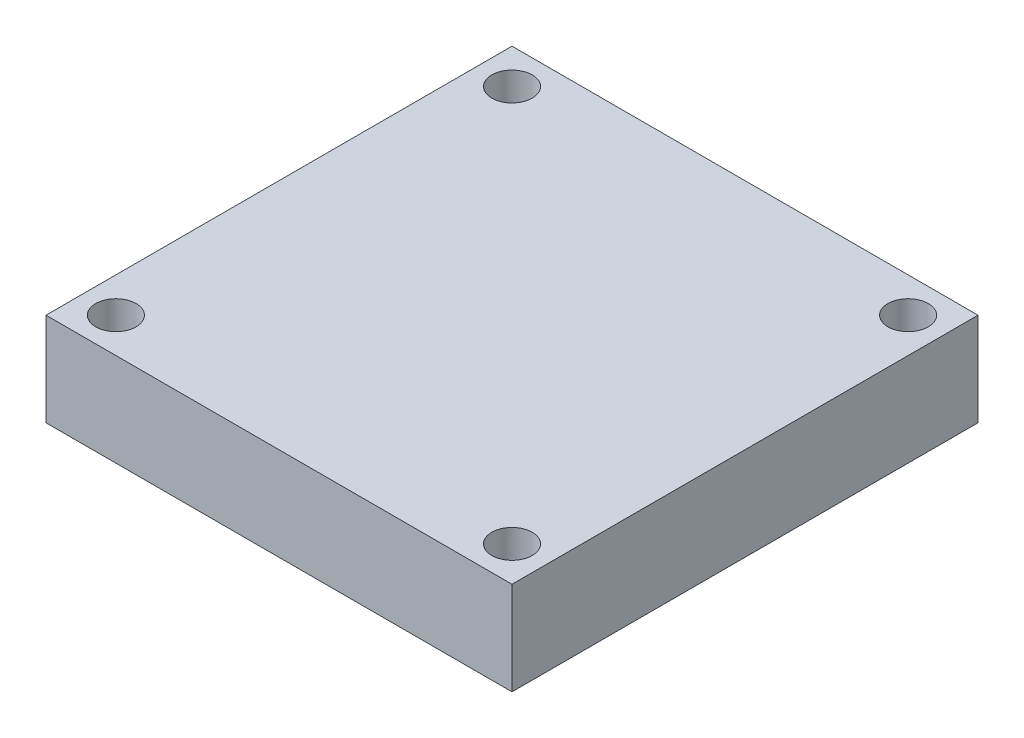
ISO-10303-21;
HEADER;
FILE_DESCRIPTION(('STEP AP214'),'2;1');
FILE_NAME('part.step','',(''),(''),'','','');
FILE_SCHEMA(('AUTOMOTIVE_DESIGN { 1 0 10303 214 1 1 1 1 }'));
ENDSEC;
DATA;
#1=APPLICATION_CONTEXT('core data for automotive mechanical design processes');
#2=APPLICATION_PROTOCOL_DEFINITION('international standard','automotive_design',2000,#1);
#3=PRODUCT_CONTEXT('',#1,'mechanical');
#4=PRODUCT('Part','Part','',(#3));
#5=PRODUCT_RELATED_PRODUCT_CATEGORY('part','',(#4));
#6=PRODUCT_DEFINITION_FORMATION('','',#4);
#7=PRODUCT_DEFINITION_CONTEXT('part definition',#1,'design');
#8=PRODUCT_DEFINITION('design','',#6,#7);
#9=PRODUCT_DEFINITION_SHAPE('','',#8);
#10=(LENGTH_UNIT() NAMED_UNIT(*) SI_UNIT(.MILLI.,.METRE.));
#11=(NAMED_UNIT(*) PLANE_ANGLE_UNIT() SI_UNIT($,.RADIAN.));
#12=(NAMED_UNIT(*) SI_UNIT($,.STERADIAN.) SOLID_ANGLE_UNIT());
#13=UNCERTAINTY_MEASURE_WITH_UNIT(LENGTH_MEASURE(1.E-05),#10,'distance_accuracy_value','');
#14=(GEOMETRIC_REPRESENTATION_CONTEXT(3) GLOBAL_UNCERTAINTY_ASSIGNED_CONTEXT((#13)) GLOBAL_UNIT_ASSIGNED_CONTEXT((#10,
#11,#12)) REPRESENTATION_CONTEXT('',''));
#15=CARTESIAN_POINT('',(0.,0.,0.));
#16=DIRECTION('',(0.,0.,1.));
#17=DIRECTION('',(1.,0.,0.));
#18=AXIS2_PLACEMENT_3D('',#15,#16,#17);
#19=CARTESIAN_POINT('',(0.,6.,0.));
#20=DIRECTION('',(0.,1.,0.));
#21=DIRECTION('',(0.,0.,1.));
#22=AXIS2_PLACEMENT_3D('',#19,#20,#21);
#23=PLANE('',#22);
#24=CARTESIAN_POINT('',(12.75,6.,12.75));
#25=DIRECTION('',(0.,1.,0.));
#26=DIRECTION('',(0.,0.,1.));
#27=AXIS2_PLACEMENT_3D('',#24,#25,#26);
#28=CIRCLE('',#27,1.3);
#29=CARTESIAN_POINT('',(12.75,6.,14.05));
#30=VERTEX_POINT('',#29);
#31=EDGE_CURVE('E130',#30,#30,#28,.T.);
#32=ORIENTED_EDGE('',*,*,#31,.F.);
#33=EDGE_LOOP('',(#32));
#34=FACE_BOUND('',#33,.T.);
#35=CARTESIAN_POINT('',(-12.75,6.,-12.75));
#36=DIRECTION('',(0.,1.,0.));
#37=DIRECTION('',(0.,0.,1.));
#38=AXIS2_PLACEMENT_3D('',#35,#36,#37);
#39=CIRCLE('',#38,1.3);
#40=CARTESIAN_POINT('',(-12.75,6.,-11.45));
#41=VERTEX_POINT('',#40);
#42=EDGE_CURVE('E106',#41,#41,#39,.T.);
#43=ORIENTED_EDGE('',*,*,#42,.F.);
#44=EDGE_LOOP('',(#43));
#45=FACE_BOUND('',#44,.T.);
#46=DIRECTION('',(0.,0.,1.));
#47=VECTOR('',#46,1.);
#48=CARTESIAN_POINT('',(-15.,6.,15.));
#49=LINE('',#48,#47);
#50=CARTESIAN_POINT('',(-15.,6.,-15.));
#51=VERTEX_POINT('',#50);
#52=CARTESIAN_POINT('',(-15.,6.,15.));
#53=VERTEX_POINT('',#52);
#54=EDGE_CURVE('E91',#51,#53,#49,.T.);
#55=ORIENTED_EDGE('',*,*,#54,.T.);
#56=DIRECTION('',(1.,0.,0.));
#57=VECTOR('',#56,1.);
#58=CARTESIAN_POINT('',(15.,6.,15.));
#59=LINE('',#58,#57);
#60=CARTESIAN_POINT('',(15.,6.,15.));
#61=VERTEX_POINT('',#60);
#62=EDGE_CURVE('E86',#53,#61,#59,.T.);
#63=ORIENTED_EDGE('',*,*,#62,.T.);
#64=DIRECTION('',(0.,0.,-1.));
#65=VECTOR('',#64,1.);
#66=CARTESIAN_POINT('',(15.,6.,15.));
#67=LINE('',#66,#65);
#68=CARTESIAN_POINT('',(15.,6.,-15.));
#69=VERTEX_POINT('',#68);
#70=EDGE_CURVE('E87',#61,#69,#67,.T.);
#71=ORIENTED_EDGE('',*,*,#70,.T.);
#72=DIRECTION('',(-1.,0.,0.));
#73=VECTOR('',#72,1.);
#74=CARTESIAN_POINT('',(15.,6.,-15.));
#75=LINE('',#74,#73);
#76=EDGE_CURVE('E57',#69,#51,#75,.T.);
#77=ORIENTED_EDGE('',*,*,#76,.T.);
#78=EDGE_LOOP('',(#55,#63,#71,#77));
#79=FACE_BOUND('',#78,.T.);
#80=CARTESIAN_POINT('',(12.75,6.,-12.75));
#81=DIRECTION('',(0.,1.,0.));
#82=DIRECTION('',(0.,0.,1.));
#83=AXIS2_PLACEMENT_3D('',#80,#81,#82);
#84=CIRCLE('',#83,1.3);
#85=CARTESIAN_POINT('',(12.75,6.,-11.45));
#86=VERTEX_POINT('',#85);
#87=EDGE_CURVE('E123',#86,#86,#84,.T.);
#88=ORIENTED_EDGE('',*,*,#87,.F.);
#89=EDGE_LOOP('',(#88));
#90=FACE_BOUND('',#89,.T.);
#91=CARTESIAN_POINT('',(-12.75,6.,12.75));
#92=DIRECTION('',(0.,1.,0.));
#93=DIRECTION('',(0.,0.,1.));
#94=AXIS2_PLACEMENT_3D('',#91,#92,#93);
#95=CIRCLE('',#94,1.3);
#96=CARTESIAN_POINT('',(-12.75,6.,14.05));
#97=VERTEX_POINT('',#96);
#98=EDGE_CURVE('E133',#97,#97,#95,.T.);
#99=ORIENTED_EDGE('',*,*,#98,.F.);
#100=EDGE_LOOP('',(#99));
#101=FACE_BOUND('',#100,.T.);
#102=ADVANCED_FACE('F39',(#34,#45,#79,#90,#101),#23,.T.);
#103=CARTESIAN_POINT('',(0.,0.,0.));
#104=DIRECTION('',(0.,1.,0.));
#105=DIRECTION('',(0.,0.,1.));
#106=AXIS2_PLACEMENT_3D('',#103,#104,#105);
#107=PLANE('',#106);
#108=DIRECTION('',(0.,0.,1.));
#109=VECTOR('',#108,1.);
#110=CARTESIAN_POINT('',(-15.,0.,15.));
#111=LINE('',#110,#109);
#112=CARTESIAN_POINT('',(-15.,0.,-15.));
#113=VERTEX_POINT('',#112);
#114=CARTESIAN_POINT('',(-15.,0.,15.));
#115=VERTEX_POINT('',#114);
#116=EDGE_CURVE('E104',#113,#115,#111,.T.);
#117=ORIENTED_EDGE('',*,*,#116,.F.);
#118=DIRECTION('',(-1.,0.,0.));
#119=VECTOR('',#118,1.);
#120=CARTESIAN_POINT('',(15.,0.,-15.));
#121=LINE('',#120,#119);
#122=CARTESIAN_POINT('',(15.,0.,-15.));
#123=VERTEX_POINT('',#122);
#124=EDGE_CURVE('E80',#123,#113,#121,.T.);
#125=ORIENTED_EDGE('',*,*,#124,.F.);
#126=DIRECTION('',(0.,0.,-1.));
#127=VECTOR('',#126,1.);
#128=CARTESIAN_POINT('',(15.,0.,15.));
#129=LINE('',#128,#127);
#130=CARTESIAN_POINT('',(15.,0.,15.));
#131=VERTEX_POINT('',#130);
#132=EDGE_CURVE('E74',#131,#123,#129,.T.);
#133=ORIENTED_EDGE('',*,*,#132,.F.);
#134=DIRECTION('',(1.,0.,0.));
#135=VECTOR('',#134,1.);
#136=CARTESIAN_POINT('',(15.,0.,15.));
#137=LINE('',#136,#135);
#138=EDGE_CURVE('E94',#115,#131,#137,.T.);
#139=ORIENTED_EDGE('',*,*,#138,.F.);
#140=EDGE_LOOP('',(#117,#125,#133,#139));
#141=FACE_BOUND('',#140,.T.);
#142=CARTESIAN_POINT('',(-12.75,0.,-12.75));
#143=DIRECTION('',(0.,1.,0.));
#144=DIRECTION('',(0.,0.,1.));
#145=AXIS2_PLACEMENT_3D('',#142,#143,#144);
#146=CIRCLE('',#145,1.3);
#147=CARTESIAN_POINT('',(-12.75,0.,-11.45));
#148=VERTEX_POINT('',#147);
#149=EDGE_CURVE('E119',#148,#148,#146,.T.);
#150=ORIENTED_EDGE('',*,*,#149,.T.);
#151=EDGE_LOOP('',(#150));
#152=FACE_BOUND('',#151,.T.);
#153=CARTESIAN_POINT('',(12.75,0.,-12.75));
#154=DIRECTION('',(0.,1.,0.));
#155=DIRECTION('',(0.,0.,1.));
#156=AXIS2_PLACEMENT_3D('',#153,#154,#155);
#157=CIRCLE('',#156,1.3);
#158=CARTESIAN_POINT('',(12.75,0.,-11.45));
#159=VERTEX_POINT('',#158);
#160=EDGE_CURVE('E125',#159,#159,#157,.T.);
#161=ORIENTED_EDGE('',*,*,#160,.T.);
#162=EDGE_LOOP('',(#161));
#163=FACE_BOUND('',#162,.T.);
#164=CARTESIAN_POINT('',(12.75,0.,12.75));
#165=DIRECTION('',(0.,1.,0.));
#166=DIRECTION('',(0.,0.,1.));
#167=AXIS2_PLACEMENT_3D('',#164,#165,#166);
#168=CIRCLE('',#167,1.3);
#169=CARTESIAN_POINT('',(12.75,0.,14.05));
#170=VERTEX_POINT('',#169);
#171=EDGE_CURVE('E127',#170,#170,#168,.T.);
#172=ORIENTED_EDGE('',*,*,#171,.T.);
#173=EDGE_LOOP('',(#172));
#174=FACE_BOUND('',#173,.T.);
#175=CARTESIAN_POINT('',(-12.75,0.,12.75));
#176=DIRECTION('',(0.,1.,0.));
#177=DIRECTION('',(0.,0.,1.));
#178=AXIS2_PLACEMENT_3D('',#175,#176,#177);
#179=CIRCLE('',#178,1.3);
#180=CARTESIAN_POINT('',(-12.75,0.,14.05));
#181=VERTEX_POINT('',#180);
#182=EDGE_CURVE('E136',#181,#181,#179,.T.);
#183=ORIENTED_EDGE('',*,*,#182,.T.);
#184=EDGE_LOOP('',(#183));
#185=FACE_BOUND('',#184,.T.);
#186=ADVANCED_FACE('F114',(#141,#152,#163,#174,#185),#107,.F.);
#187=CARTESIAN_POINT('',(-15.,6.,15.));
#188=DIRECTION('',(1.,0.,0.));
#189=DIRECTION('',(0.,0.,-1.));
#190=AXIS2_PLACEMENT_3D('',#187,#188,#189);
#191=PLANE('',#190);
#192=ORIENTED_EDGE('',*,*,#116,.T.);
#193=DIRECTION('',(0.,-1.,0.));
#194=VECTOR('',#193,1.);
#195=CARTESIAN_POINT('',(-15.,6.,15.));
#196=LINE('',#195,#194);
#197=EDGE_CURVE('E11',#53,#115,#196,.T.);
#198=ORIENTED_EDGE('',*,*,#197,.F.);
#199=ORIENTED_EDGE('',*,*,#54,.F.);
#200=DIRECTION('',(0.,-1.,0.));
#201=VECTOR('',#200,1.);
#202=CARTESIAN_POINT('',(-15.,6.,-15.));
#203=LINE('',#202,#201);
#204=EDGE_CURVE('E98',#51,#113,#203,.T.);
#205=ORIENTED_EDGE('',*,*,#204,.T.);
#206=EDGE_LOOP('',(#192,#198,#199,#205));
#207=FACE_BOUND('',#206,.T.);
#208=ADVANCED_FACE('F41',(#207),#191,.F.);
#209=CARTESIAN_POINT('',(15.,6.,15.));
#210=DIRECTION('',(0.,0.,-1.));
#211=DIRECTION('',(-1.,0.,0.));
#212=AXIS2_PLACEMENT_3D('',#209,#210,#211);
#213=PLANE('',#212);
#214=ORIENTED_EDGE('',*,*,#138,.T.);
#215=DIRECTION('',(0.,-1.,0.));
#216=VECTOR('',#215,1.);
#217=CARTESIAN_POINT('',(15.,6.,15.));
#218=LINE('',#217,#216);
#219=EDGE_CURVE('E48',#61,#131,#218,.T.);
#220=ORIENTED_EDGE('',*,*,#219,.F.);
#221=ORIENTED_EDGE('',*,*,#62,.F.);
#222=ORIENTED_EDGE('',*,*,#197,.T.);
#223=EDGE_LOOP('',(#214,#220,#221,#222));
#224=FACE_BOUND('',#223,.T.);
#225=ADVANCED_FACE('F92',(#224),#213,.F.);
#226=CARTESIAN_POINT('',(15.,6.,15.));
#227=DIRECTION('',(-1.,0.,0.));
#228=DIRECTION('',(0.,0.,1.));
#229=AXIS2_PLACEMENT_3D('',#226,#227,#228);
#230=PLANE('',#229);
#231=ORIENTED_EDGE('',*,*,#132,.T.);
#232=DIRECTION('',(0.,-1.,0.));
#233=VECTOR('',#232,1.);
#234=CARTESIAN_POINT('',(15.,6.,-15.));
#235=LINE('',#234,#233);
#236=EDGE_CURVE('E96',#69,#123,#235,.T.);
#237=ORIENTED_EDGE('',*,*,#236,.F.);
#238=ORIENTED_EDGE('',*,*,#70,.F.);
#239=ORIENTED_EDGE('',*,*,#219,.T.);
#240=EDGE_LOOP('',(#231,#237,#238,#239));
#241=FACE_BOUND('',#240,.T.);
#242=ADVANCED_FACE('F100',(#241),#230,.F.);
#243=CARTESIAN_POINT('',(15.,6.,-15.));
#244=DIRECTION('',(0.,0.,1.));
#245=DIRECTION('',(1.,0.,0.));
#246=AXIS2_PLACEMENT_3D('',#243,#244,#245);
#247=PLANE('',#246);
#248=ORIENTED_EDGE('',*,*,#124,.T.);
#249=ORIENTED_EDGE('',*,*,#204,.F.);
#250=ORIENTED_EDGE('',*,*,#76,.F.);
#251=ORIENTED_EDGE('',*,*,#236,.T.);
#252=EDGE_LOOP('',(#248,#249,#250,#251));
#253=FACE_BOUND('',#252,.T.);
#254=ADVANCED_FACE('F112',(#253),#247,.F.);
#255=CARTESIAN_POINT('',(-12.75,6.,-12.75));
#256=DIRECTION('',(0.,-1.,0.));
#257=DIRECTION('',(0.,0.,-1.));
#258=AXIS2_PLACEMENT_3D('',#255,#256,#257);
#259=CYLINDRICAL_SURFACE('',#258,1.3);
#260=ORIENTED_EDGE('',*,*,#42,.T.);
#261=EDGE_LOOP('',(#260));
#262=FACE_BOUND('',#261,.T.);
#263=ORIENTED_EDGE('',*,*,#149,.F.);
#264=EDGE_LOOP('',(#263));
#265=FACE_BOUND('',#264,.T.);
#266=ADVANCED_FACE('F155',(#262,#265),#259,.F.);
#267=CARTESIAN_POINT('',(12.75,6.,-12.75));
#268=DIRECTION('',(0.,-1.,0.));
#269=DIRECTION('',(0.,0.,-1.));
#270=AXIS2_PLACEMENT_3D('',#267,#268,#269);
#271=CYLINDRICAL_SURFACE('',#270,1.3);
#272=ORIENTED_EDGE('',*,*,#87,.T.);
#273=EDGE_LOOP('',(#272));
#274=FACE_BOUND('',#273,.T.);
#275=ORIENTED_EDGE('',*,*,#160,.F.);
#276=EDGE_LOOP('',(#275));
#277=FACE_BOUND('',#276,.T.);
#278=ADVANCED_FACE('F200',(#274,#277),#271,.F.);
#279=CARTESIAN_POINT('',(12.75,6.,12.75));
#280=DIRECTION('',(0.,-1.,0.));
#281=DIRECTION('',(0.,0.,-1.));
#282=AXIS2_PLACEMENT_3D('',#279,#280,#281);
#283=CYLINDRICAL_SURFACE('',#282,1.3);
#284=ORIENTED_EDGE('',*,*,#31,.T.);
#285=EDGE_LOOP('',(#284));
#286=FACE_BOUND('',#285,.T.);
#287=ORIENTED_EDGE('',*,*,#171,.F.);
#288=EDGE_LOOP('',(#287));
#289=FACE_BOUND('',#288,.T.);
#290=ADVANCED_FACE('F209',(#286,#289),#283,.F.);
#291=CARTESIAN_POINT('',(-12.75,6.,12.75));
#292=DIRECTION('',(0.,-1.,0.));
#293=DIRECTION('',(0.,0.,-1.));
#294=AXIS2_PLACEMENT_3D('',#291,#292,#293);
#295=CYLINDRICAL_SURFACE('',#294,1.3);
#296=ORIENTED_EDGE('',*,*,#98,.T.);
#297=EDGE_LOOP('',(#296));
#298=FACE_BOUND('',#297,.T.);
#299=ORIENTED_EDGE('',*,*,#182,.F.);
#300=EDGE_LOOP('',(#299));
#301=FACE_BOUND('',#300,.T.);
#302=ADVANCED_FACE('F145',(#298,#301),#295,.F.);
#303=CLOSED_SHELL('',(#102,#186,#208,#225,#242,#254,#266,#278,#290,#302));
#304=MANIFOLD_SOLID_BREP('B2',#303);
#305=ADVANCED_BREP_SHAPE_REPRESENTATION('',(#18,#304),#14);
#306=SHAPE_DEFINITION_REPRESENTATION(#9,#305);
ENDSEC;
END-ISO-10303-21;
